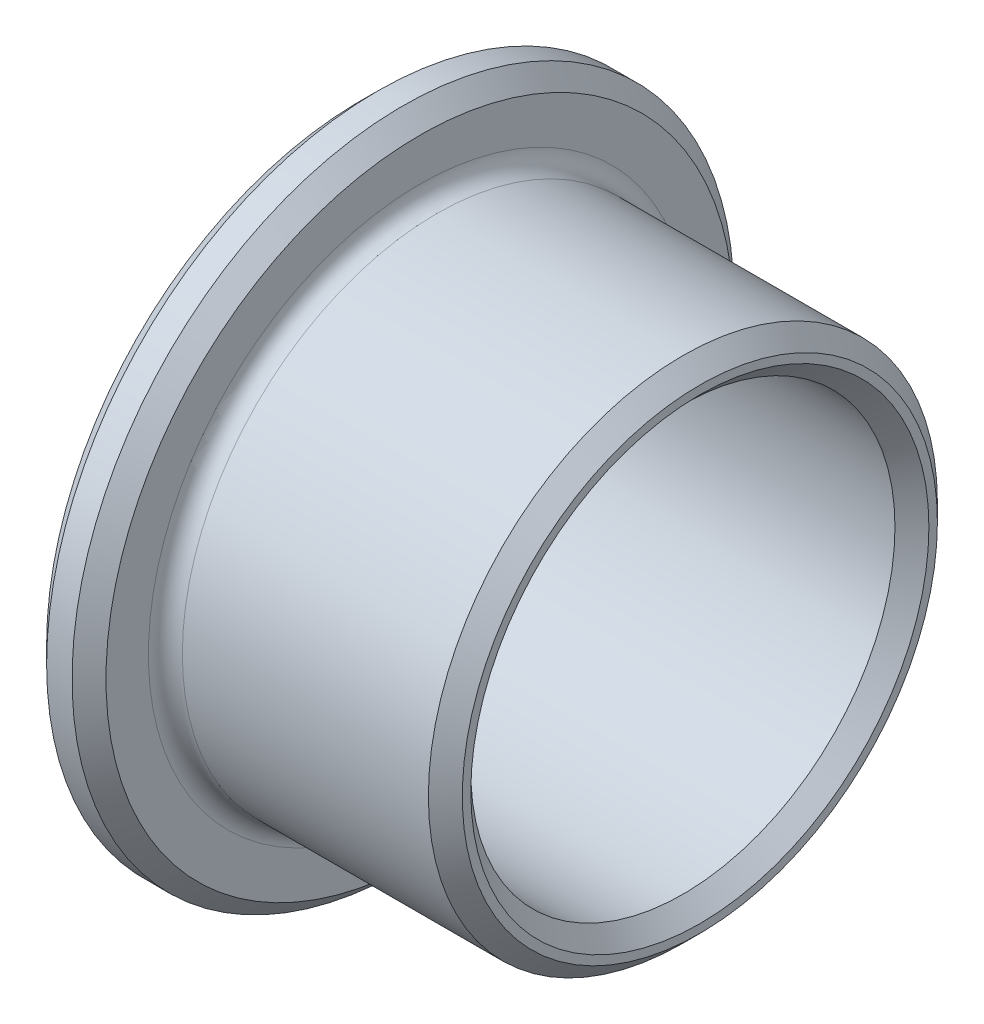
ISO-10303-21;
HEADER;
FILE_DESCRIPTION(('STEP AP214'),'2;1');
FILE_NAME('part.step','',(''),(''),'','','');
FILE_SCHEMA(('AUTOMOTIVE_DESIGN { 1 0 10303 214 1 1 1 1 }'));
ENDSEC;
DATA;
#1=APPLICATION_CONTEXT('core data for automotive mechanical design processes');
#2=APPLICATION_PROTOCOL_DEFINITION('international standard','automotive_design',2000,#1);
#3=PRODUCT_CONTEXT('',#1,'mechanical');
#4=PRODUCT('Part','Part','',(#3));
#5=PRODUCT_RELATED_PRODUCT_CATEGORY('part','',(#4));
#6=PRODUCT_DEFINITION_FORMATION('','',#4);
#7=PRODUCT_DEFINITION_CONTEXT('part definition',#1,'design');
#8=PRODUCT_DEFINITION('design','',#6,#7);
#9=PRODUCT_DEFINITION_SHAPE('','',#8);
#10=(LENGTH_UNIT() NAMED_UNIT(*) SI_UNIT(.MILLI.,.METRE.));
#11=(NAMED_UNIT(*) PLANE_ANGLE_UNIT() SI_UNIT($,.RADIAN.));
#12=(NAMED_UNIT(*) SI_UNIT($,.STERADIAN.) SOLID_ANGLE_UNIT());
#13=UNCERTAINTY_MEASURE_WITH_UNIT(LENGTH_MEASURE(1.E-05),#10,'distance_accuracy_value','');
#14=(GEOMETRIC_REPRESENTATION_CONTEXT(3) GLOBAL_UNCERTAINTY_ASSIGNED_CONTEXT((#13)) GLOBAL_UNIT_ASSIGNED_CONTEXT((#10,
#11,#12)) REPRESENTATION_CONTEXT('',''));
#15=CARTESIAN_POINT('',(0.,0.,0.));
#16=DIRECTION('',(0.,0.,1.));
#17=DIRECTION('',(1.,0.,0.));
#18=AXIS2_PLACEMENT_3D('',#15,#16,#17);
#19=CARTESIAN_POINT('',(0.,19.5,0.));
#20=DIRECTION('',(1.,0.,0.));
#21=DIRECTION('',(0.,0.,1.));
#22=AXIS2_PLACEMENT_3D('',#19,#20,#21);
#23=PLANE('',#22);
#24=CARTESIAN_POINT('',(0.,0.,0.));
#25=DIRECTION('',(-1.,0.,0.));
#26=DIRECTION('',(0.,0.,1.));
#27=AXIS2_PLACEMENT_3D('',#24,#25,#26);
#28=CIRCLE('',#27,13.5);
#29=CARTESIAN_POINT('',(0.,0.,13.5));
#30=VERTEX_POINT('',#29);
#31=EDGE_CURVE('E67',#30,#30,#28,.T.);
#32=ORIENTED_EDGE('',*,*,#31,.F.);
#33=EDGE_LOOP('',(#32));
#34=FACE_BOUND('',#33,.T.);
#35=CARTESIAN_POINT('',(0.,0.,0.));
#36=DIRECTION('',(-1.,0.,0.));
#37=DIRECTION('',(0.,0.,1.));
#38=AXIS2_PLACEMENT_3D('',#35,#36,#37);
#39=CIRCLE('',#38,18.5);
#40=CARTESIAN_POINT('',(0.,0.,18.5));
#41=VERTEX_POINT('',#40);
#42=EDGE_CURVE('E70',#41,#41,#39,.F.);
#43=ORIENTED_EDGE('',*,*,#42,.F.);
#44=EDGE_LOOP('',(#43));
#45=FACE_BOUND('',#44,.T.);
#46=ADVANCED_FACE('F35',(#34,#45),#23,.F.);
#47=CARTESIAN_POINT('',(0.,0.,0.));
#48=DIRECTION('',(-1.,0.,0.));
#49=DIRECTION('',(0.,0.,-1.));
#50=AXIS2_PLACEMENT_3D('',#47,#48,#49);
#51=CYLINDRICAL_SURFACE('',#50,12.5);
#52=CARTESIAN_POINT('',(1.00000000000001,0.,0.));
#53=DIRECTION('',(-1.,0.,0.));
#54=DIRECTION('',(0.,0.,1.));
#55=AXIS2_PLACEMENT_3D('',#52,#53,#54);
#56=CIRCLE('',#55,12.5);
#57=CARTESIAN_POINT('',(1.00000000000001,0.,12.5));
#58=VERTEX_POINT('',#57);
#59=EDGE_CURVE('E73',#58,#58,#56,.F.);
#60=ORIENTED_EDGE('',*,*,#59,.F.);
#61=EDGE_LOOP('',(#60));
#62=FACE_BOUND('',#61,.T.);
#63=CARTESIAN_POINT('',(19.,0.,0.));
#64=DIRECTION('',(1.,0.,0.));
#65=DIRECTION('',(0.,0.,-1.));
#66=AXIS2_PLACEMENT_3D('',#63,#64,#65);
#67=CIRCLE('',#66,12.5);
#68=CARTESIAN_POINT('',(19.,0.,-12.5));
#69=VERTEX_POINT('',#68);
#70=EDGE_CURVE('E76',#69,#69,#67,.F.);
#71=ORIENTED_EDGE('',*,*,#70,.F.);
#72=EDGE_LOOP('',(#71));
#73=FACE_BOUND('',#72,.T.);
#74=ADVANCED_FACE('F83',(#62,#73),#51,.F.);
#75=CARTESIAN_POINT('',(20.,12.5,0.));
#76=DIRECTION('',(-1.,0.,0.));
#77=DIRECTION('',(0.,0.,-1.));
#78=AXIS2_PLACEMENT_3D('',#75,#76,#77);
#79=PLANE('',#78);
#80=CARTESIAN_POINT('',(20.,0.,0.));
#81=DIRECTION('',(1.,0.,0.));
#82=DIRECTION('',(0.,0.,-1.));
#83=AXIS2_PLACEMENT_3D('',#80,#81,#82);
#84=CIRCLE('',#83,13.5);
#85=CARTESIAN_POINT('',(20.,0.,-13.5));
#86=VERTEX_POINT('',#85);
#87=EDGE_CURVE('E61',#86,#86,#84,.T.);
#88=ORIENTED_EDGE('',*,*,#87,.F.);
#89=EDGE_LOOP('',(#88));
#90=FACE_BOUND('',#89,.T.);
#91=CARTESIAN_POINT('',(20.,0.,0.));
#92=DIRECTION('',(1.,0.,0.));
#93=DIRECTION('',(0.,0.,-1.));
#94=AXIS2_PLACEMENT_3D('',#91,#92,#93);
#95=CIRCLE('',#94,14.);
#96=CARTESIAN_POINT('',(20.,0.,-14.));
#97=VERTEX_POINT('',#96);
#98=EDGE_CURVE('E64',#97,#97,#95,.F.);
#99=ORIENTED_EDGE('',*,*,#98,.F.);
#100=EDGE_LOOP('',(#99));
#101=FACE_BOUND('',#100,.T.);
#102=ADVANCED_FACE('F85',(#90,#101),#79,.F.);
#103=CARTESIAN_POINT('',(0.,0.,0.));
#104=DIRECTION('',(-1.,0.,0.));
#105=DIRECTION('',(0.,0.,-1.));
#106=AXIS2_PLACEMENT_3D('',#103,#104,#105);
#107=CYLINDRICAL_SURFACE('',#106,15.);
#108=CARTESIAN_POINT('',(4.5,0.,0.));
#109=DIRECTION('',(1.,0.,0.));
#110=DIRECTION('',(0.,0.,-1.));
#111=AXIS2_PLACEMENT_3D('',#108,#109,#110);
#112=CIRCLE('',#111,15.);
#113=CARTESIAN_POINT('',(4.5,0.,-15.));
#114=VERTEX_POINT('',#113);
#115=EDGE_CURVE('E10',#114,#114,#112,.F.);
#116=ORIENTED_EDGE('',*,*,#115,.F.);
#117=EDGE_LOOP('',(#116));
#118=FACE_BOUND('',#117,.T.);
#119=CARTESIAN_POINT('',(19.,0.,0.));
#120=DIRECTION('',(1.,0.,0.));
#121=DIRECTION('',(0.,0.,-1.));
#122=AXIS2_PLACEMENT_3D('',#119,#120,#121);
#123=CIRCLE('',#122,15.);
#124=CARTESIAN_POINT('',(19.,0.,-15.));
#125=VERTEX_POINT('',#124);
#126=EDGE_CURVE('E46',#125,#125,#123,.T.);
#127=ORIENTED_EDGE('',*,*,#126,.F.);
#128=EDGE_LOOP('',(#127));
#129=FACE_BOUND('',#128,.T.);
#130=ADVANCED_FACE('F92',(#118,#129),#107,.T.);
#131=CARTESIAN_POINT('',(3.5,15.,0.));
#132=DIRECTION('',(-1.,0.,0.));
#133=DIRECTION('',(0.,0.,-1.));
#134=AXIS2_PLACEMENT_3D('',#131,#132,#133);
#135=PLANE('',#134);
#136=CARTESIAN_POINT('',(3.5,0.,0.));
#137=DIRECTION('',(1.,0.,0.));
#138=DIRECTION('',(0.,0.,-1.));
#139=AXIS2_PLACEMENT_3D('',#136,#137,#138);
#140=CIRCLE('',#139,16.);
#141=CARTESIAN_POINT('',(3.5,0.,-16.));
#142=VERTEX_POINT('',#141);
#143=EDGE_CURVE('E42',#142,#142,#140,.T.);
#144=ORIENTED_EDGE('',*,*,#143,.F.);
#145=EDGE_LOOP('',(#144));
#146=FACE_BOUND('',#145,.T.);
#147=CARTESIAN_POINT('',(3.5,0.,0.));
#148=DIRECTION('',(1.,0.,0.));
#149=DIRECTION('',(0.,0.,-1.));
#150=AXIS2_PLACEMENT_3D('',#147,#148,#149);
#151=CIRCLE('',#150,18.5);
#152=CARTESIAN_POINT('',(3.5,0.,-18.5));
#153=VERTEX_POINT('',#152);
#154=EDGE_CURVE('E50',#153,#153,#151,.F.);
#155=ORIENTED_EDGE('',*,*,#154,.F.);
#156=EDGE_LOOP('',(#155));
#157=FACE_BOUND('',#156,.T.);
#158=ADVANCED_FACE('F125',(#146,#157),#135,.F.);
#159=CARTESIAN_POINT('',(0.,0.,0.));
#160=DIRECTION('',(-1.,0.,0.));
#161=DIRECTION('',(0.,0.,-1.));
#162=AXIS2_PLACEMENT_3D('',#159,#160,#161);
#163=CYLINDRICAL_SURFACE('',#162,19.5);
#164=CARTESIAN_POINT('',(2.49999999999999,0.,0.));
#165=DIRECTION('',(1.,0.,0.));
#166=DIRECTION('',(0.,0.,-1.));
#167=AXIS2_PLACEMENT_3D('',#164,#165,#166);
#168=CIRCLE('',#167,19.5);
#169=CARTESIAN_POINT('',(2.49999999999999,0.,-19.5));
#170=VERTEX_POINT('',#169);
#171=EDGE_CURVE('E55',#170,#170,#168,.T.);
#172=ORIENTED_EDGE('',*,*,#171,.F.);
#173=EDGE_LOOP('',(#172));
#174=FACE_BOUND('',#173,.T.);
#175=CARTESIAN_POINT('',(1.00000000000001,0.,0.));
#176=DIRECTION('',(-1.,0.,0.));
#177=DIRECTION('',(0.,0.,1.));
#178=AXIS2_PLACEMENT_3D('',#175,#176,#177);
#179=CIRCLE('',#178,19.5);
#180=CARTESIAN_POINT('',(1.00000000000001,0.,19.5));
#181=VERTEX_POINT('',#180);
#182=EDGE_CURVE('E58',#181,#181,#179,.T.);
#183=ORIENTED_EDGE('',*,*,#182,.F.);
#184=EDGE_LOOP('',(#183));
#185=FACE_BOUND('',#184,.T.);
#186=ADVANCED_FACE('F103',(#174,#185),#163,.T.);
#187=CARTESIAN_POINT('',(1.00000000000001,0.,0.));
#188=DIRECTION('',(-1.,0.,0.));
#189=DIRECTION('',(0.,0.,-1.));
#190=AXIS2_PLACEMENT_3D('',#187,#188,#189);
#191=CONICAL_SURFACE('',#190,12.5,0.785398163397451);
#192=ORIENTED_EDGE('',*,*,#31,.T.);
#193=EDGE_LOOP('',(#192));
#194=FACE_BOUND('',#193,.T.);
#195=ORIENTED_EDGE('',*,*,#59,.T.);
#196=EDGE_LOOP('',(#195));
#197=FACE_BOUND('',#196,.T.);
#198=ADVANCED_FACE('F100',(#194,#197),#191,.F.);
#199=CARTESIAN_POINT('',(20.,0.,0.));
#200=DIRECTION('',(1.,0.,0.));
#201=DIRECTION('',(0.,0.,1.));
#202=AXIS2_PLACEMENT_3D('',#199,#200,#201);
#203=CONICAL_SURFACE('',#202,13.5,0.785398163397448);
#204=ORIENTED_EDGE('',*,*,#70,.T.);
#205=EDGE_LOOP('',(#204));
#206=FACE_BOUND('',#205,.T.);
#207=ORIENTED_EDGE('',*,*,#87,.T.);
#208=EDGE_LOOP('',(#207));
#209=FACE_BOUND('',#208,.T.);
#210=ADVANCED_FACE('F80',(#206,#209),#203,.F.);
#211=CARTESIAN_POINT('',(2.49999999999999,0.,0.));
#212=DIRECTION('',(-1.,0.,0.));
#213=DIRECTION('',(0.,0.,-1.));
#214=AXIS2_PLACEMENT_3D('',#211,#212,#213);
#215=CONICAL_SURFACE('',#214,19.5,0.785398163397452);
#216=ORIENTED_EDGE('',*,*,#154,.T.);
#217=EDGE_LOOP('',(#216));
#218=FACE_BOUND('',#217,.T.);
#219=ORIENTED_EDGE('',*,*,#171,.T.);
#220=EDGE_LOOP('',(#219));
#221=FACE_BOUND('',#220,.T.);
#222=ADVANCED_FACE('F107',(#218,#221),#215,.T.);
#223=CARTESIAN_POINT('',(0.,0.,0.));
#224=DIRECTION('',(1.,0.,0.));
#225=DIRECTION('',(0.,0.,1.));
#226=AXIS2_PLACEMENT_3D('',#223,#224,#225);
#227=CONICAL_SURFACE('',#226,18.5,0.785398163397447);
#228=ORIENTED_EDGE('',*,*,#182,.T.);
#229=EDGE_LOOP('',(#228));
#230=FACE_BOUND('',#229,.T.);
#231=ORIENTED_EDGE('',*,*,#42,.T.);
#232=EDGE_LOOP('',(#231));
#233=FACE_BOUND('',#232,.T.);
#234=ADVANCED_FACE('F110',(#230,#233),#227,.T.);
#235=CARTESIAN_POINT('',(19.,0.,0.));
#236=DIRECTION('',(-1.,0.,0.));
#237=DIRECTION('',(0.,0.,-1.));
#238=AXIS2_PLACEMENT_3D('',#235,#236,#237);
#239=CONICAL_SURFACE('',#238,15.,0.785398163397449);
#240=ORIENTED_EDGE('',*,*,#98,.T.);
#241=EDGE_LOOP('',(#240));
#242=FACE_BOUND('',#241,.T.);
#243=ORIENTED_EDGE('',*,*,#126,.T.);
#244=EDGE_LOOP('',(#243));
#245=FACE_BOUND('',#244,.T.);
#246=ADVANCED_FACE('F113',(#242,#245),#239,.T.);
#247=CARTESIAN_POINT('',(4.5,0.,0.));
#248=DIRECTION('',(-1.,0.,0.));
#249=DIRECTION('',(0.,0.,-1.));
#250=AXIS2_PLACEMENT_3D('',#247,#248,#249);
#251=TOROIDAL_SURFACE('',#250,16.,1.);
#252=ORIENTED_EDGE('',*,*,#115,.T.);
#253=EDGE_LOOP('',(#252));
#254=FACE_BOUND('',#253,.T.);
#255=ORIENTED_EDGE('',*,*,#143,.T.);
#256=EDGE_LOOP('',(#255));
#257=FACE_BOUND('',#256,.T.);
#258=ADVANCED_FACE('F37',(#254,#257),#251,.F.);
#259=CLOSED_SHELL('',(#46,#74,#102,#130,#158,#186,#198,#210,#222,#234,#246,#258));
#260=MANIFOLD_SOLID_BREP('B2',#259);
#261=ADVANCED_BREP_SHAPE_REPRESENTATION('',(#18,#260),#14);
#262=SHAPE_DEFINITION_REPRESENTATION(#9,#261);
ENDSEC;
END-ISO-10303-21;
